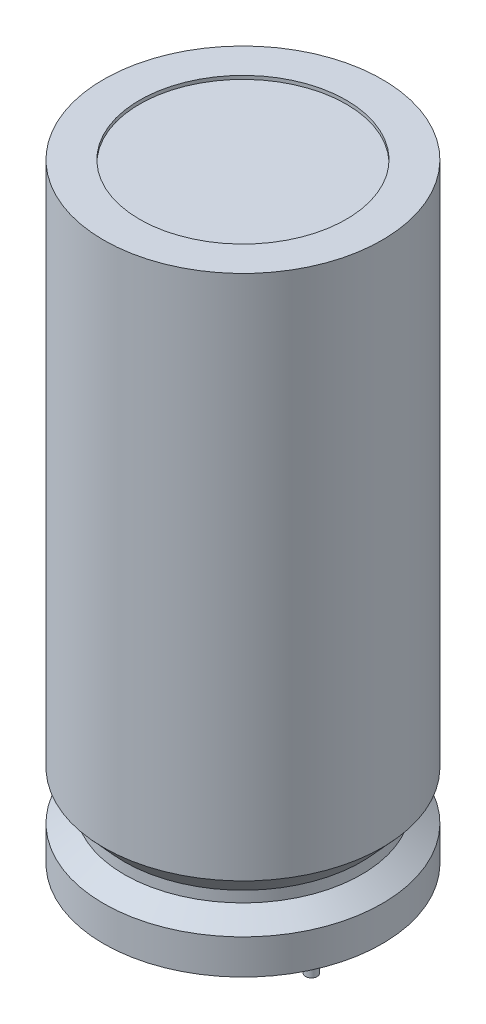
ISO-10303-21;
HEADER;
FILE_DESCRIPTION(('STEP AP214'),'2;1');
FILE_NAME('part.step','',(''),(''),'','','');
FILE_SCHEMA(('AUTOMOTIVE_DESIGN { 1 0 10303 214 1 1 1 1 }'));
ENDSEC;
DATA;
#1=APPLICATION_CONTEXT('core data for automotive mechanical design processes');
#2=APPLICATION_PROTOCOL_DEFINITION('international standard','automotive_design',2000,#1);
#3=PRODUCT_CONTEXT('',#1,'mechanical');
#4=PRODUCT('Part','Part','',(#3));
#5=PRODUCT_RELATED_PRODUCT_CATEGORY('part','',(#4));
#6=PRODUCT_DEFINITION_FORMATION('','',#4);
#7=PRODUCT_DEFINITION_CONTEXT('part definition',#1,'design');
#8=PRODUCT_DEFINITION('design','',#6,#7);
#9=PRODUCT_DEFINITION_SHAPE('','',#8);
#10=(LENGTH_UNIT() NAMED_UNIT(*) SI_UNIT(.MILLI.,.METRE.));
#11=(NAMED_UNIT(*) PLANE_ANGLE_UNIT() SI_UNIT($,.RADIAN.));
#12=(NAMED_UNIT(*) SI_UNIT($,.STERADIAN.) SOLID_ANGLE_UNIT());
#13=UNCERTAINTY_MEASURE_WITH_UNIT(LENGTH_MEASURE(1.E-05),#10,'distance_accuracy_value','');
#14=(GEOMETRIC_REPRESENTATION_CONTEXT(3) GLOBAL_UNCERTAINTY_ASSIGNED_CONTEXT((#13)) GLOBAL_UNIT_ASSIGNED_CONTEXT((#10,
#11,#12)) REPRESENTATION_CONTEXT('',''));
#15=CARTESIAN_POINT('',(0.,0.,0.));
#16=DIRECTION('',(0.,0.,1.));
#17=DIRECTION('',(1.,0.,0.));
#18=AXIS2_PLACEMENT_3D('',#15,#16,#17);
#19=CARTESIAN_POINT('',(0.,0.,0.));
#20=DIRECTION('',(0.,-1.,0.));
#21=DIRECTION('',(0.,0.,-1.));
#22=AXIS2_PLACEMENT_3D('',#19,#20,#21);
#23=PLANE('',#22);
#24=CARTESIAN_POINT('',(0.,0.,0.));
#25=DIRECTION('',(0.,-1.,0.));
#26=DIRECTION('',(0.,0.,-1.));
#27=AXIS2_PLACEMENT_3D('',#24,#25,#26);
#28=CIRCLE('',#27,5.53059289538301);
#29=CARTESIAN_POINT('',(0.,0.,-5.53059289538301));
#30=VERTEX_POINT('',#29);
#31=EDGE_CURVE('E49',#30,#30,#28,.T.);
#32=ORIENTED_EDGE('',*,*,#31,.F.);
#33=EDGE_LOOP('',(#32));
#34=FACE_BOUND('',#33,.T.);
#35=CARTESIAN_POINT('',(0.,0.,0.));
#36=DIRECTION('',(0.,1.,0.));
#37=DIRECTION('',(0.,0.,1.));
#38=AXIS2_PLACEMENT_3D('',#35,#36,#37);
#39=CIRCLE('',#38,8.);
#40=CARTESIAN_POINT('',(0.,0.,8.));
#41=VERTEX_POINT('',#40);
#42=EDGE_CURVE('E77',#41,#41,#39,.T.);
#43=ORIENTED_EDGE('',*,*,#42,.F.);
#44=EDGE_LOOP('',(#43));
#45=FACE_BOUND('',#44,.T.);
#46=ADVANCED_FACE('F42',(#34,#45),#23,.T.);
#47=CARTESIAN_POINT('',(0.,10.4272659588828,0.));
#48=DIRECTION('',(0.,1.,0.));
#49=DIRECTION('',(0.,0.,1.));
#50=AXIS2_PLACEMENT_3D('',#47,#48,#49);
#51=CYLINDRICAL_SURFACE('',#50,8.);
#52=ORIENTED_EDGE('',*,*,#42,.T.);
#53=EDGE_LOOP('',(#52));
#54=FACE_BOUND('',#53,.T.);
#55=CARTESIAN_POINT('',(0.,2.,0.));
#56=DIRECTION('',(0.,1.,0.));
#57=DIRECTION('',(0.,0.,1.));
#58=AXIS2_PLACEMENT_3D('',#55,#56,#57);
#59=CIRCLE('',#58,8.);
#60=CARTESIAN_POINT('',(0.,2.,8.));
#61=VERTEX_POINT('',#60);
#62=EDGE_CURVE('E74',#61,#61,#59,.T.);
#63=ORIENTED_EDGE('',*,*,#62,.F.);
#64=EDGE_LOOP('',(#63));
#65=FACE_BOUND('',#64,.T.);
#66=ADVANCED_FACE('F81',(#54,#65),#51,.T.);
#67=CARTESIAN_POINT('',(0.,2.84756707956501,0.));
#68=DIRECTION('',(0.,-1.,0.));
#69=DIRECTION('',(0.,0.,-1.));
#70=AXIS2_PLACEMENT_3D('',#67,#68,#69);
#71=CONICAL_SURFACE('',#70,6.80907137461903,0.952270474479356);
#72=ORIENTED_EDGE('',*,*,#62,.T.);
#73=EDGE_LOOP('',(#72));
#74=FACE_BOUND('',#73,.T.);
#75=CARTESIAN_POINT('',(0.,2.84756707956501,0.));
#76=DIRECTION('',(0.,1.,0.));
#77=DIRECTION('',(0.,0.,1.));
#78=AXIS2_PLACEMENT_3D('',#75,#76,#77);
#79=CIRCLE('',#78,6.80907137461903);
#80=CARTESIAN_POINT('',(0.,2.84756707956501,6.80907137461903));
#81=VERTEX_POINT('',#80);
#82=EDGE_CURVE('E71',#81,#81,#79,.T.);
#83=ORIENTED_EDGE('',*,*,#82,.F.);
#84=EDGE_LOOP('',(#83));
#85=FACE_BOUND('',#84,.T.);
#86=ADVANCED_FACE('F90',(#74,#85),#71,.T.);
#87=CARTESIAN_POINT('',(0.,10.4272659588828,0.));
#88=DIRECTION('',(0.,1.,0.));
#89=DIRECTION('',(0.,0.,1.));
#90=AXIS2_PLACEMENT_3D('',#87,#88,#89);
#91=CYLINDRICAL_SURFACE('',#90,6.80907137461903);
#92=ORIENTED_EDGE('',*,*,#82,.T.);
#93=EDGE_LOOP('',(#92));
#94=FACE_BOUND('',#93,.T.);
#95=CARTESIAN_POINT('',(0.,3.47841510204752,0.));
#96=DIRECTION('',(0.,1.,0.));
#97=DIRECTION('',(0.,0.,1.));
#98=AXIS2_PLACEMENT_3D('',#95,#96,#97);
#99=CIRCLE('',#98,6.80907137461903);
#100=CARTESIAN_POINT('',(0.,3.47841510204752,6.80907137461903));
#101=VERTEX_POINT('',#100);
#102=EDGE_CURVE('E68',#101,#101,#99,.T.);
#103=ORIENTED_EDGE('',*,*,#102,.F.);
#104=EDGE_LOOP('',(#103));
#105=FACE_BOUND('',#104,.T.);
#106=ADVANCED_FACE('F95',(#94,#105),#91,.T.);
#107=CARTESIAN_POINT('',(0.,4.7841020701184,0.));
#108=DIRECTION('',(0.,1.,0.));
#109=DIRECTION('',(0.,0.,1.));
#110=AXIS2_PLACEMENT_3D('',#107,#108,#109);
#111=CONICAL_SURFACE('',#110,8.,0.739464931403303);
#112=ORIENTED_EDGE('',*,*,#102,.T.);
#113=EDGE_LOOP('',(#112));
#114=FACE_BOUND('',#113,.T.);
#115=CARTESIAN_POINT('',(0.,4.7841020701184,0.));
#116=DIRECTION('',(0.,1.,0.));
#117=DIRECTION('',(0.,0.,1.));
#118=AXIS2_PLACEMENT_3D('',#115,#116,#117);
#119=CIRCLE('',#118,8.);
#120=CARTESIAN_POINT('',(0.,4.7841020701184,8.));
#121=VERTEX_POINT('',#120);
#122=EDGE_CURVE('E65',#121,#121,#119,.T.);
#123=ORIENTED_EDGE('',*,*,#122,.F.);
#124=EDGE_LOOP('',(#123));
#125=FACE_BOUND('',#124,.T.);
#126=ADVANCED_FACE('F99',(#114,#125),#111,.T.);
#127=CARTESIAN_POINT('',(0.,10.4272659588828,0.));
#128=DIRECTION('',(0.,1.,0.));
#129=DIRECTION('',(0.,0.,1.));
#130=AXIS2_PLACEMENT_3D('',#127,#128,#129);
#131=CYLINDRICAL_SURFACE('',#130,8.);
#132=ORIENTED_EDGE('',*,*,#122,.T.);
#133=EDGE_LOOP('',(#132));
#134=FACE_BOUND('',#133,.T.);
#135=CARTESIAN_POINT('',(0.,35.,0.));
#136=DIRECTION('',(0.,1.,0.));
#137=DIRECTION('',(0.,0.,1.));
#138=AXIS2_PLACEMENT_3D('',#135,#136,#137);
#139=CIRCLE('',#138,8.);
#140=CARTESIAN_POINT('',(0.,35.,8.));
#141=VERTEX_POINT('',#140);
#142=EDGE_CURVE('E62',#141,#141,#139,.T.);
#143=ORIENTED_EDGE('',*,*,#142,.F.);
#144=EDGE_LOOP('',(#143));
#145=FACE_BOUND('',#144,.T.);
#146=ADVANCED_FACE('F103',(#134,#145),#131,.T.);
#147=CARTESIAN_POINT('',(-8.,35.,0.));
#148=DIRECTION('',(0.,1.,0.));
#149=DIRECTION('',(0.,0.,1.));
#150=AXIS2_PLACEMENT_3D('',#147,#148,#149);
#151=PLANE('',#150);
#152=CARTESIAN_POINT('',(0.,35.,0.));
#153=DIRECTION('',(0.,1.,0.));
#154=DIRECTION('',(0.,0.,1.));
#155=AXIS2_PLACEMENT_3D('',#152,#153,#154);
#156=CIRCLE('',#155,5.93451457037567);
#157=CARTESIAN_POINT('',(0.,35.,5.93451457037567));
#158=VERTEX_POINT('',#157);
#159=EDGE_CURVE('E57',#158,#158,#156,.T.);
#160=ORIENTED_EDGE('',*,*,#159,.F.);
#161=EDGE_LOOP('',(#160));
#162=FACE_BOUND('',#161,.T.);
#163=ORIENTED_EDGE('',*,*,#142,.T.);
#164=EDGE_LOOP('',(#163));
#165=FACE_BOUND('',#164,.T.);
#166=ADVANCED_FACE('F107',(#162,#165),#151,.T.);
#167=CARTESIAN_POINT('',(0.,34.8,0.));
#168=DIRECTION('',(0.,1.,0.));
#169=DIRECTION('',(0.,0.,1.));
#170=AXIS2_PLACEMENT_3D('',#167,#168,#169);
#171=CYLINDRICAL_SURFACE('',#170,5.93451457037567);
#172=CARTESIAN_POINT('',(0.,34.8,0.));
#173=DIRECTION('',(0.,1.,0.));
#174=DIRECTION('',(0.,0.,1.));
#175=AXIS2_PLACEMENT_3D('',#172,#173,#174);
#176=CIRCLE('',#175,5.93451457037567);
#177=CARTESIAN_POINT('',(0.,34.8,5.93451457037567));
#178=VERTEX_POINT('',#177);
#179=EDGE_CURVE('E53',#178,#178,#176,.T.);
#180=ORIENTED_EDGE('',*,*,#179,.F.);
#181=EDGE_LOOP('',(#180));
#182=FACE_BOUND('',#181,.T.);
#183=ORIENTED_EDGE('',*,*,#159,.T.);
#184=EDGE_LOOP('',(#183));
#185=FACE_BOUND('',#184,.T.);
#186=ADVANCED_FACE('F111',(#182,#185),#171,.F.);
#187=CARTESIAN_POINT('',(0.,34.8,0.));
#188=DIRECTION('',(0.,1.,0.));
#189=DIRECTION('',(0.,0.,1.));
#190=AXIS2_PLACEMENT_3D('',#187,#188,#189);
#191=PLANE('',#190);
#192=ORIENTED_EDGE('',*,*,#179,.T.);
#193=EDGE_LOOP('',(#192));
#194=FACE_BOUND('',#193,.T.);
#195=ADVANCED_FACE('F115',(#194),#191,.T.);
#196=CARTESIAN_POINT('',(0.,0.2,0.));
#197=DIRECTION('',(0.,-1.,0.));
#198=DIRECTION('',(0.,0.,-1.));
#199=AXIS2_PLACEMENT_3D('',#196,#197,#198);
#200=CYLINDRICAL_SURFACE('',#199,5.53059289538301);
#201=CARTESIAN_POINT('',(0.,0.2,0.));
#202=DIRECTION('',(0.,-1.,0.));
#203=DIRECTION('',(0.,0.,-1.));
#204=AXIS2_PLACEMENT_3D('',#201,#202,#203);
#205=CIRCLE('',#204,5.53059289538301);
#206=CARTESIAN_POINT('',(0.,0.2,-5.53059289538301));
#207=VERTEX_POINT('',#206);
#208=EDGE_CURVE('E11',#207,#207,#205,.T.);
#209=ORIENTED_EDGE('',*,*,#208,.F.);
#210=EDGE_LOOP('',(#209));
#211=FACE_BOUND('',#210,.T.);
#212=ORIENTED_EDGE('',*,*,#31,.T.);
#213=EDGE_LOOP('',(#212));
#214=FACE_BOUND('',#213,.T.);
#215=ADVANCED_FACE('F118',(#211,#214),#200,.F.);
#216=CARTESIAN_POINT('',(0.,0.2,0.));
#217=DIRECTION('',(0.,-1.,0.));
#218=DIRECTION('',(0.,0.,-1.));
#219=AXIS2_PLACEMENT_3D('',#216,#217,#218);
#220=PLANE('',#219);
#221=ORIENTED_EDGE('',*,*,#208,.T.);
#222=EDGE_LOOP('',(#221));
#223=FACE_BOUND('',#222,.T.);
#224=ADVANCED_FACE('F44',(#223),#220,.T.);
#225=CLOSED_SHELL('',(#46,#66,#86,#106,#126,#146,#166,#186,#195,#215,#224));
#226=MANIFOLD_SOLID_BREP('B2',#225);
#227=CARTESIAN_POINT('',(3.92920448548837,-3.5,0.));
#228=DIRECTION('',(0.,-1.,0.));
#229=DIRECTION('',(0.,0.,-1.));
#230=AXIS2_PLACEMENT_3D('',#227,#228,#229);
#231=PLANE('',#230);
#232=CARTESIAN_POINT('',(3.92920448548837,-3.5,0.));
#233=DIRECTION('',(0.,-1.,0.));
#234=DIRECTION('',(0.,0.,-1.));
#235=AXIS2_PLACEMENT_3D('',#232,#233,#234);
#236=CIRCLE('',#235,0.33291061372802);
#237=CARTESIAN_POINT('',(3.92920448548837,-3.5,-0.33291061372802));
#238=VERTEX_POINT('',#237);
#239=EDGE_CURVE('E217',#238,#238,#236,.T.);
#240=ORIENTED_EDGE('',*,*,#239,.T.);
#241=EDGE_LOOP('',(#240));
#242=FACE_BOUND('',#241,.T.);
#243=ADVANCED_FACE('F210',(#242),#231,.T.);
#244=CARTESIAN_POINT('',(3.92920448548837,-3.5,0.));
#245=DIRECTION('',(0.,1.,0.));
#246=DIRECTION('',(0.,0.,1.));
#247=AXIS2_PLACEMENT_3D('',#244,#245,#246);
#248=CYLINDRICAL_SURFACE('',#247,0.33291061372802);
#249=ORIENTED_EDGE('',*,*,#239,.F.);
#250=EDGE_LOOP('',(#249));
#251=FACE_BOUND('',#250,.T.);
#252=CARTESIAN_POINT('',(3.92920448548837,0.,0.));
#253=DIRECTION('',(0.,-1.,0.));
#254=DIRECTION('',(0.,0.,-1.));
#255=AXIS2_PLACEMENT_3D('',#252,#253,#254);
#256=CIRCLE('',#255,0.33291061372802);
#257=CARTESIAN_POINT('',(3.92920448548837,0.,-0.33291061372802));
#258=VERTEX_POINT('',#257);
#259=EDGE_CURVE('E41',#258,#258,#256,.T.);
#260=ORIENTED_EDGE('',*,*,#259,.T.);
#261=EDGE_LOOP('',(#260));
#262=FACE_BOUND('',#261,.T.);
#263=ADVANCED_FACE('F224',(#251,#262),#248,.T.);
#264=CARTESIAN_POINT('',(0.,0.,0.));
#265=DIRECTION('',(0.,-1.,0.));
#266=DIRECTION('',(0.,0.,-1.));
#267=AXIS2_PLACEMENT_3D('',#264,#265,#266);
#268=PLANE('',#267);
#269=ORIENTED_EDGE('',*,*,#259,.F.);
#270=EDGE_LOOP('',(#269));
#271=FACE_BOUND('',#270,.T.);
#272=ADVANCED_FACE('F212',(#271),#268,.F.);
#273=CLOSED_SHELL('',(#243,#263,#272));
#274=MANIFOLD_SOLID_BREP('B6',#273);
#275=CARTESIAN_POINT('',(-3.58592199227668,-3.5,0.));
#276=DIRECTION('',(0.,-1.,0.));
#277=DIRECTION('',(0.,0.,-1.));
#278=AXIS2_PLACEMENT_3D('',#275,#276,#277);
#279=PLANE('',#278);
#280=CARTESIAN_POINT('',(-3.58592199227668,-3.5,0.));
#281=DIRECTION('',(0.,-1.,0.));
#282=DIRECTION('',(0.,0.,-1.));
#283=AXIS2_PLACEMENT_3D('',#280,#281,#282);
#284=CIRCLE('',#283,0.337317785536318);
#285=CARTESIAN_POINT('',(-3.58592199227668,-3.5,-0.337317785536318));
#286=VERTEX_POINT('',#285);
#287=EDGE_CURVE('E209',#286,#286,#284,.T.);
#288=ORIENTED_EDGE('',*,*,#287,.T.);
#289=EDGE_LOOP('',(#288));
#290=FACE_BOUND('',#289,.T.);
#291=ADVANCED_FACE('F251',(#290),#279,.T.);
#292=CARTESIAN_POINT('',(-3.58592199227668,-3.5,0.));
#293=DIRECTION('',(0.,1.,0.));
#294=DIRECTION('',(0.,0.,1.));
#295=AXIS2_PLACEMENT_3D('',#292,#293,#294);
#296=CYLINDRICAL_SURFACE('',#295,0.337317785536318);
#297=ORIENTED_EDGE('',*,*,#287,.F.);
#298=EDGE_LOOP('',(#297));
#299=FACE_BOUND('',#298,.T.);
#300=CARTESIAN_POINT('',(-3.58592199227668,0.,0.));
#301=DIRECTION('',(0.,-1.,0.));
#302=DIRECTION('',(0.,0.,-1.));
#303=AXIS2_PLACEMENT_3D('',#300,#301,#302);
#304=CIRCLE('',#303,0.337317785536318);
#305=CARTESIAN_POINT('',(-3.58592199227668,0.,-0.337317785536318));
#306=VERTEX_POINT('',#305);
#307=EDGE_CURVE('E258',#306,#306,#304,.T.);
#308=ORIENTED_EDGE('',*,*,#307,.T.);
#309=EDGE_LOOP('',(#308));
#310=FACE_BOUND('',#309,.T.);
#311=ADVANCED_FACE('F253',(#299,#310),#296,.T.);
#312=CARTESIAN_POINT('',(0.,0.,0.));
#313=DIRECTION('',(0.,-1.,0.));
#314=DIRECTION('',(0.,0.,-1.));
#315=AXIS2_PLACEMENT_3D('',#312,#313,#314);
#316=PLANE('',#315);
#317=ORIENTED_EDGE('',*,*,#307,.F.);
#318=EDGE_LOOP('',(#317));
#319=FACE_BOUND('',#318,.T.);
#320=ADVANCED_FACE('F265',(#319),#316,.F.);
#321=CLOSED_SHELL('',(#291,#311,#320));
#322=MANIFOLD_SOLID_BREP('B36',#321);
#323=ADVANCED_BREP_SHAPE_REPRESENTATION('',(#18,#226,#274,#322),#14);
#324=SHAPE_DEFINITION_REPRESENTATION(#9,#323);
ENDSEC;
END-ISO-10303-21;
